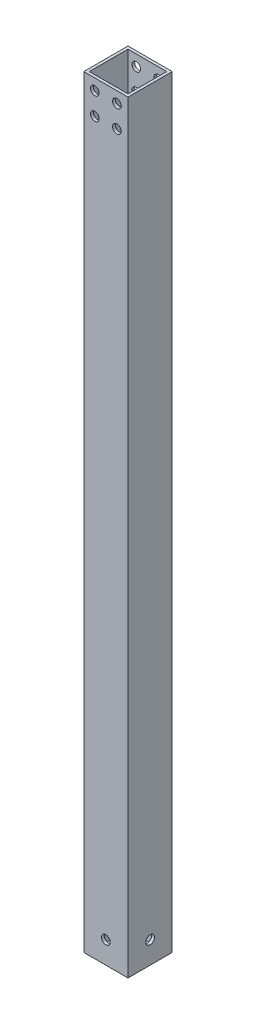
ISO-10303-21;
HEADER;
FILE_DESCRIPTION(('STEP AP214'),'2;1');
FILE_NAME('part.step','',(''),(''),'','','');
FILE_SCHEMA(('AUTOMOTIVE_DESIGN { 1 0 10303 214 1 1 1 1 }'));
ENDSEC;
DATA;
#1=APPLICATION_CONTEXT('core data for automotive mechanical design processes');
#2=APPLICATION_PROTOCOL_DEFINITION('international standard','automotive_design',2000,#1);
#3=PRODUCT_CONTEXT('',#1,'mechanical');
#4=PRODUCT('Part','Part','',(#3));
#5=PRODUCT_RELATED_PRODUCT_CATEGORY('part','',(#4));
#6=PRODUCT_DEFINITION_FORMATION('','',#4);
#7=PRODUCT_DEFINITION_CONTEXT('part definition',#1,'design');
#8=PRODUCT_DEFINITION('design','',#6,#7);
#9=PRODUCT_DEFINITION_SHAPE('','',#8);
#10=(LENGTH_UNIT() NAMED_UNIT(*) SI_UNIT(.MILLI.,.METRE.));
#11=(NAMED_UNIT(*) PLANE_ANGLE_UNIT() SI_UNIT($,.RADIAN.));
#12=(NAMED_UNIT(*) SI_UNIT($,.STERADIAN.) SOLID_ANGLE_UNIT());
#13=UNCERTAINTY_MEASURE_WITH_UNIT(LENGTH_MEASURE(1.E-05),#10,'distance_accuracy_value','');
#14=(GEOMETRIC_REPRESENTATION_CONTEXT(3) GLOBAL_UNCERTAINTY_ASSIGNED_CONTEXT((#13)) GLOBAL_UNIT_ASSIGNED_CONTEXT((#10,
#11,#12)) REPRESENTATION_CONTEXT('',''));
#15=CARTESIAN_POINT('',(0.,0.,0.));
#16=DIRECTION('',(0.,0.,1.));
#17=DIRECTION('',(1.,0.,0.));
#18=AXIS2_PLACEMENT_3D('',#15,#16,#17);
#19=CARTESIAN_POINT('',(12.7,955.562720587149,-25.4));
#20=DIRECTION('',(0.,1.,0.));
#21=DIRECTION('',(0.,0.,1.));
#22=AXIS2_PLACEMENT_3D('',#19,#20,#21);
#23=PLANE('',#22);
#24=DIRECTION('',(-1.,0.,0.));
#25=VECTOR('',#24,1.);
#26=CARTESIAN_POINT('',(12.7,955.562720587149,0.));
#27=LINE('',#26,#25);
#28=CARTESIAN_POINT('',(38.1000000000002,955.562720587149,0.));
#29=VERTEX_POINT('',#28);
#30=CARTESIAN_POINT('',(12.7,955.562720587149,0.));
#31=VERTEX_POINT('',#30);
#32=EDGE_CURVE('E143',#29,#31,#27,.T.);
#33=ORIENTED_EDGE('',*,*,#32,.F.);
#34=DIRECTION('',(0.,0.,1.));
#35=VECTOR('',#34,1.);
#36=CARTESIAN_POINT('',(38.1000000000002,955.562720587149,-25.4));
#37=LINE('',#36,#35);
#38=CARTESIAN_POINT('',(38.1000000000002,955.562720587149,-25.4));
#39=VERTEX_POINT('',#38);
#40=EDGE_CURVE('E46',#39,#29,#37,.T.);
#41=ORIENTED_EDGE('',*,*,#40,.F.);
#42=DIRECTION('',(-1.,0.,0.));
#43=VECTOR('',#42,1.);
#44=CARTESIAN_POINT('',(12.7,955.562720587149,-25.4));
#45=LINE('',#44,#43);
#46=CARTESIAN_POINT('',(12.7,955.562720587149,-25.4));
#47=VERTEX_POINT('',#46);
#48=EDGE_CURVE('E149',#39,#47,#45,.T.);
#49=ORIENTED_EDGE('',*,*,#48,.T.);
#50=DIRECTION('',(0.,0.,1.));
#51=VECTOR('',#50,1.);
#52=CARTESIAN_POINT('',(12.7,955.562720587149,-25.4));
#53=LINE('',#52,#51);
#54=EDGE_CURVE('E11',#47,#31,#53,.T.);
#55=ORIENTED_EDGE('',*,*,#54,.T.);
#56=EDGE_LOOP('',(#33,#41,#49,#55));
#57=FACE_BOUND('',#56,.T.);
#58=DIRECTION('',(0.,0.,1.));
#59=VECTOR('',#58,1.);
#60=CARTESIAN_POINT('',(36.5125000000002,955.562720587149,-25.4));
#61=LINE('',#60,#59);
#62=CARTESIAN_POINT('',(36.5125000000002,955.562720587149,-23.8125));
#63=VERTEX_POINT('',#62);
#64=CARTESIAN_POINT('',(36.5125000000002,955.562720587149,-1.5875));
#65=VERTEX_POINT('',#64);
#66=EDGE_CURVE('E113',#63,#65,#61,.T.);
#67=ORIENTED_EDGE('',*,*,#66,.T.);
#68=DIRECTION('',(-1.,0.,0.));
#69=VECTOR('',#68,1.);
#70=CARTESIAN_POINT('',(0.,955.562720587149,-1.5875));
#71=LINE('',#70,#69);
#72=CARTESIAN_POINT('',(14.2875,955.562720587149,-1.5875));
#73=VERTEX_POINT('',#72);
#74=EDGE_CURVE('E119',#65,#73,#71,.T.);
#75=ORIENTED_EDGE('',*,*,#74,.T.);
#76=DIRECTION('',(0.,0.,1.));
#77=VECTOR('',#76,1.);
#78=CARTESIAN_POINT('',(14.2875,955.562720587149,-25.4));
#79=LINE('',#78,#77);
#80=CARTESIAN_POINT('',(14.2875,955.562720587149,-23.8125));
#81=VERTEX_POINT('',#80);
#82=EDGE_CURVE('E104',#81,#73,#79,.T.);
#83=ORIENTED_EDGE('',*,*,#82,.F.);
#84=DIRECTION('',(-1.,0.,0.));
#85=VECTOR('',#84,1.);
#86=CARTESIAN_POINT('',(0.,955.562720587149,-23.8125));
#87=LINE('',#86,#85);
#88=EDGE_CURVE('E54',#63,#81,#87,.T.);
#89=ORIENTED_EDGE('',*,*,#88,.F.);
#90=EDGE_LOOP('',(#67,#75,#83,#89));
#91=FACE_BOUND('',#90,.T.);
#92=ADVANCED_FACE('F37',(#57,#91),#23,.T.);
#93=CARTESIAN_POINT('',(12.7,517.412720587149,-25.4));
#94=DIRECTION('',(0.,-1.,0.));
#95=DIRECTION('',(0.,0.,-1.));
#96=AXIS2_PLACEMENT_3D('',#93,#94,#95);
#97=PLANE('',#96);
#98=DIRECTION('',(1.,0.,0.));
#99=VECTOR('',#98,1.);
#100=CARTESIAN_POINT('',(12.7,517.412720587149,0.));
#101=LINE('',#100,#99);
#102=CARTESIAN_POINT('',(12.7,517.412720587149,0.));
#103=VERTEX_POINT('',#102);
#104=CARTESIAN_POINT('',(38.1000000000003,517.412720587149,0.));
#105=VERTEX_POINT('',#104);
#106=EDGE_CURVE('E155',#103,#105,#101,.T.);
#107=ORIENTED_EDGE('',*,*,#106,.F.);
#108=DIRECTION('',(0.,0.,1.));
#109=VECTOR('',#108,1.);
#110=CARTESIAN_POINT('',(12.7,517.412720587149,-25.4));
#111=LINE('',#110,#109);
#112=CARTESIAN_POINT('',(12.7,517.412720587149,-25.4));
#113=VERTEX_POINT('',#112);
#114=EDGE_CURVE('E152',#113,#103,#111,.T.);
#115=ORIENTED_EDGE('',*,*,#114,.F.);
#116=DIRECTION('',(1.,0.,0.));
#117=VECTOR('',#116,1.);
#118=CARTESIAN_POINT('',(12.7,517.412720587149,-25.4));
#119=LINE('',#118,#117);
#120=CARTESIAN_POINT('',(38.1000000000003,517.412720587149,-25.4));
#121=VERTEX_POINT('',#120);
#122=EDGE_CURVE('E142',#113,#121,#119,.T.);
#123=ORIENTED_EDGE('',*,*,#122,.T.);
#124=DIRECTION('',(0.,0.,1.));
#125=VECTOR('',#124,1.);
#126=CARTESIAN_POINT('',(38.1000000000003,517.412720587149,-25.4));
#127=LINE('',#126,#125);
#128=EDGE_CURVE('E164',#121,#105,#127,.T.);
#129=ORIENTED_EDGE('',*,*,#128,.T.);
#130=EDGE_LOOP('',(#107,#115,#123,#129));
#131=FACE_BOUND('',#130,.T.);
#132=DIRECTION('',(0.,0.,1.));
#133=VECTOR('',#132,1.);
#134=CARTESIAN_POINT('',(14.2875,517.412720587149,-25.4));
#135=LINE('',#134,#133);
#136=CARTESIAN_POINT('',(14.2875,517.412720587149,-23.8125));
#137=VERTEX_POINT('',#136);
#138=CARTESIAN_POINT('',(14.2875,517.412720587149,-1.5875));
#139=VERTEX_POINT('',#138);
#140=EDGE_CURVE('E133',#137,#139,#135,.T.);
#141=ORIENTED_EDGE('',*,*,#140,.T.);
#142=DIRECTION('',(1.,0.,0.));
#143=VECTOR('',#142,1.);
#144=CARTESIAN_POINT('',(0.,517.412720587149,-1.5875));
#145=LINE('',#144,#143);
#146=CARTESIAN_POINT('',(36.5125000000003,517.412720587149,-1.5875));
#147=VERTEX_POINT('',#146);
#148=EDGE_CURVE('E122',#139,#147,#145,.T.);
#149=ORIENTED_EDGE('',*,*,#148,.T.);
#150=DIRECTION('',(0.,0.,1.));
#151=VECTOR('',#150,1.);
#152=CARTESIAN_POINT('',(36.5125000000003,517.412720587149,-25.4));
#153=LINE('',#152,#151);
#154=CARTESIAN_POINT('',(36.5125000000003,517.412720587149,-23.8125));
#155=VERTEX_POINT('',#154);
#156=EDGE_CURVE('E131',#155,#147,#153,.T.);
#157=ORIENTED_EDGE('',*,*,#156,.F.);
#158=DIRECTION('',(1.,0.,0.));
#159=VECTOR('',#158,1.);
#160=CARTESIAN_POINT('',(0.,517.412720587149,-23.8125));
#161=LINE('',#160,#159);
#162=EDGE_CURVE('E59',#137,#155,#161,.T.);
#163=ORIENTED_EDGE('',*,*,#162,.F.);
#164=EDGE_LOOP('',(#141,#149,#157,#163));
#165=FACE_BOUND('',#164,.T.);
#166=ADVANCED_FACE('F201',(#131,#165),#97,.T.);
#167=CARTESIAN_POINT('',(12.7,955.562720587149,-25.4));
#168=DIRECTION('',(-1.,0.,0.));
#169=DIRECTION('',(0.,-1.,0.));
#170=AXIS2_PLACEMENT_3D('',#167,#168,#169);
#171=PLANE('',#170);
#172=CARTESIAN_POINT('',(12.7000000000002,530.112720587149,-12.7));
#173=DIRECTION('',(1.,0.,0.));
#174=DIRECTION('',(0.,1.,0.));
#175=AXIS2_PLACEMENT_3D('',#172,#173,#174);
#176=CIRCLE('',#175,2.4892);
#177=CARTESIAN_POINT('',(12.7000000000002,532.601920587149,-12.7));
#178=VERTEX_POINT('',#177);
#179=EDGE_CURVE('E271',#178,#178,#176,.T.);
#180=ORIENTED_EDGE('',*,*,#179,.T.);
#181=EDGE_LOOP('',(#180));
#182=FACE_BOUND('',#181,.T.);
#183=DIRECTION('',(0.,-1.,0.));
#184=VECTOR('',#183,1.);
#185=CARTESIAN_POINT('',(12.7,955.562720587149,0.));
#186=LINE('',#185,#184);
#187=EDGE_CURVE('E112',#31,#103,#186,.T.);
#188=ORIENTED_EDGE('',*,*,#187,.F.);
#189=ORIENTED_EDGE('',*,*,#54,.F.);
#190=DIRECTION('',(0.,-1.,0.));
#191=VECTOR('',#190,1.);
#192=CARTESIAN_POINT('',(12.7,955.562720587149,-25.4));
#193=LINE('',#192,#191);
#194=EDGE_CURVE('E139',#47,#113,#193,.T.);
#195=ORIENTED_EDGE('',*,*,#194,.T.);
#196=ORIENTED_EDGE('',*,*,#114,.T.);
#197=EDGE_LOOP('',(#188,#189,#195,#196));
#198=FACE_BOUND('',#197,.T.);
#199=ADVANCED_FACE('F39',(#182,#198),#171,.T.);
#200=CARTESIAN_POINT('',(38.1000000000002,955.562720587149,-25.4));
#201=DIRECTION('',(1.,0.,0.));
#202=DIRECTION('',(0.,1.,0.));
#203=AXIS2_PLACEMENT_3D('',#200,#201,#202);
#204=PLANE('',#203);
#205=CARTESIAN_POINT('',(38.1000000000002,530.112720587149,-12.7));
#206=DIRECTION('',(1.,0.,0.));
#207=DIRECTION('',(0.,1.,0.));
#208=AXIS2_PLACEMENT_3D('',#205,#206,#207);
#209=CIRCLE('',#208,2.4892);
#210=CARTESIAN_POINT('',(38.1000000000002,532.601920587149,-12.7));
#211=VERTEX_POINT('',#210);
#212=EDGE_CURVE('E283',#211,#211,#209,.T.);
#213=ORIENTED_EDGE('',*,*,#212,.F.);
#214=EDGE_LOOP('',(#213));
#215=FACE_BOUND('',#214,.T.);
#216=DIRECTION('',(0.,1.,0.));
#217=VECTOR('',#216,1.);
#218=CARTESIAN_POINT('',(38.1000000000002,955.562720587149,0.));
#219=LINE('',#218,#217);
#220=EDGE_CURVE('E158',#105,#29,#219,.T.);
#221=ORIENTED_EDGE('',*,*,#220,.F.);
#222=ORIENTED_EDGE('',*,*,#128,.F.);
#223=DIRECTION('',(0.,1.,0.));
#224=VECTOR('',#223,1.);
#225=CARTESIAN_POINT('',(38.1000000000002,955.562720587149,-25.4));
#226=LINE('',#225,#224);
#227=EDGE_CURVE('E146',#121,#39,#226,.T.);
#228=ORIENTED_EDGE('',*,*,#227,.T.);
#229=ORIENTED_EDGE('',*,*,#40,.T.);
#230=EDGE_LOOP('',(#221,#222,#228,#229));
#231=FACE_BOUND('',#230,.T.);
#232=ADVANCED_FACE('F208',(#215,#231),#204,.T.);
#233=CARTESIAN_POINT('',(0.,0.,-25.4));
#234=DIRECTION('',(0.,0.,1.));
#235=DIRECTION('',(1.,0.,0.));
#236=AXIS2_PLACEMENT_3D('',#233,#234,#235);
#237=PLANE('',#236);
#238=CARTESIAN_POINT('',(25.4000000000001,530.112720587149,-25.4));
#239=DIRECTION('',(0.,0.,1.));
#240=DIRECTION('',(1.,0.,0.));
#241=AXIS2_PLACEMENT_3D('',#238,#239,#240);
#242=CIRCLE('',#241,2.48919999999996);
#243=CARTESIAN_POINT('',(27.8892,530.112720587149,-25.4));
#244=VERTEX_POINT('',#243);
#245=EDGE_CURVE('E171',#244,#244,#242,.T.);
#246=ORIENTED_EDGE('',*,*,#245,.T.);
#247=EDGE_LOOP('',(#246));
#248=FACE_BOUND('',#247,.T.);
#249=CARTESIAN_POINT('',(31.7500000000001,949.212720587149,-25.4));
#250=DIRECTION('',(0.,0.,1.));
#251=DIRECTION('',(1.,0.,0.));
#252=AXIS2_PLACEMENT_3D('',#249,#250,#251);
#253=CIRCLE('',#252,2.48919999999991);
#254=CARTESIAN_POINT('',(34.2392,949.212720587149,-25.4));
#255=VERTEX_POINT('',#254);
#256=EDGE_CURVE('E293',#255,#255,#253,.T.);
#257=ORIENTED_EDGE('',*,*,#256,.T.);
#258=EDGE_LOOP('',(#257));
#259=FACE_BOUND('',#258,.T.);
#260=CARTESIAN_POINT('',(19.0500000000001,949.212720587149,-25.4));
#261=DIRECTION('',(0.,0.,1.));
#262=DIRECTION('',(1.,0.,0.));
#263=AXIS2_PLACEMENT_3D('',#260,#261,#262);
#264=CIRCLE('',#263,2.48919999999989);
#265=CARTESIAN_POINT('',(21.5392,949.212720587149,-25.4));
#266=VERTEX_POINT('',#265);
#267=EDGE_CURVE('E299',#266,#266,#264,.T.);
#268=ORIENTED_EDGE('',*,*,#267,.T.);
#269=EDGE_LOOP('',(#268));
#270=FACE_BOUND('',#269,.T.);
#271=CARTESIAN_POINT('',(19.0500000000001,936.512720587149,-25.4));
#272=DIRECTION('',(0.,0.,1.));
#273=DIRECTION('',(1.,0.,0.));
#274=AXIS2_PLACEMENT_3D('',#271,#272,#273);
#275=CIRCLE('',#274,2.48919999999989);
#276=CARTESIAN_POINT('',(21.5392,936.512720587149,-25.4));
#277=VERTEX_POINT('',#276);
#278=EDGE_CURVE('E305',#277,#277,#275,.T.);
#279=ORIENTED_EDGE('',*,*,#278,.T.);
#280=EDGE_LOOP('',(#279));
#281=FACE_BOUND('',#280,.T.);
#282=CARTESIAN_POINT('',(31.7500000000001,936.512720587149,-25.4));
#283=DIRECTION('',(0.,0.,1.));
#284=DIRECTION('',(1.,0.,0.));
#285=AXIS2_PLACEMENT_3D('',#282,#283,#284);
#286=CIRCLE('',#285,2.48919999999991);
#287=CARTESIAN_POINT('',(34.2392,936.512720587149,-25.4));
#288=VERTEX_POINT('',#287);
#289=EDGE_CURVE('E275',#288,#288,#286,.T.);
#290=ORIENTED_EDGE('',*,*,#289,.T.);
#291=EDGE_LOOP('',(#290));
#292=FACE_BOUND('',#291,.T.);
#293=ORIENTED_EDGE('',*,*,#194,.F.);
#294=ORIENTED_EDGE('',*,*,#48,.F.);
#295=ORIENTED_EDGE('',*,*,#227,.F.);
#296=ORIENTED_EDGE('',*,*,#122,.F.);
#297=EDGE_LOOP('',(#293,#294,#295,#296));
#298=FACE_BOUND('',#297,.T.);
#299=ADVANCED_FACE('F215',(#248,#259,#270,#281,#292,#298),#237,.F.);
#300=CARTESIAN_POINT('',(0.,0.,0.));
#301=DIRECTION('',(0.,0.,1.));
#302=DIRECTION('',(1.,0.,0.));
#303=AXIS2_PLACEMENT_3D('',#300,#301,#302);
#304=PLANE('',#303);
#305=CARTESIAN_POINT('',(25.4000000000001,530.112720587149,0.));
#306=DIRECTION('',(0.,0.,1.));
#307=DIRECTION('',(1.,0.,0.));
#308=AXIS2_PLACEMENT_3D('',#305,#306,#307);
#309=CIRCLE('',#308,2.48919999999996);
#310=CARTESIAN_POINT('',(27.8892,530.112720587149,0.));
#311=VERTEX_POINT('',#310);
#312=EDGE_CURVE('E287',#311,#311,#309,.T.);
#313=ORIENTED_EDGE('',*,*,#312,.F.);
#314=EDGE_LOOP('',(#313));
#315=FACE_BOUND('',#314,.T.);
#316=CARTESIAN_POINT('',(31.7500000000001,949.212720587149,0.));
#317=DIRECTION('',(0.,0.,1.));
#318=DIRECTION('',(1.,0.,0.));
#319=AXIS2_PLACEMENT_3D('',#316,#317,#318);
#320=CIRCLE('',#319,2.48919999999991);
#321=CARTESIAN_POINT('',(34.2392,949.212720587149,0.));
#322=VERTEX_POINT('',#321);
#323=EDGE_CURVE('E290',#322,#322,#320,.T.);
#324=ORIENTED_EDGE('',*,*,#323,.F.);
#325=EDGE_LOOP('',(#324));
#326=FACE_BOUND('',#325,.T.);
#327=CARTESIAN_POINT('',(19.0500000000001,949.212720587149,0.));
#328=DIRECTION('',(0.,0.,1.));
#329=DIRECTION('',(1.,0.,0.));
#330=AXIS2_PLACEMENT_3D('',#327,#328,#329);
#331=CIRCLE('',#330,2.48919999999989);
#332=CARTESIAN_POINT('',(21.5392,949.212720587149,0.));
#333=VERTEX_POINT('',#332);
#334=EDGE_CURVE('E296',#333,#333,#331,.T.);
#335=ORIENTED_EDGE('',*,*,#334,.F.);
#336=EDGE_LOOP('',(#335));
#337=FACE_BOUND('',#336,.T.);
#338=CARTESIAN_POINT('',(19.0500000000001,936.512720587149,0.));
#339=DIRECTION('',(0.,0.,1.));
#340=DIRECTION('',(1.,0.,0.));
#341=AXIS2_PLACEMENT_3D('',#338,#339,#340);
#342=CIRCLE('',#341,2.48919999999989);
#343=CARTESIAN_POINT('',(21.5392,936.512720587149,0.));
#344=VERTEX_POINT('',#343);
#345=EDGE_CURVE('E302',#344,#344,#342,.T.);
#346=ORIENTED_EDGE('',*,*,#345,.F.);
#347=EDGE_LOOP('',(#346));
#348=FACE_BOUND('',#347,.T.);
#349=CARTESIAN_POINT('',(31.7500000000001,936.512720587149,0.));
#350=DIRECTION('',(0.,0.,1.));
#351=DIRECTION('',(1.,0.,0.));
#352=AXIS2_PLACEMENT_3D('',#349,#350,#351);
#353=CIRCLE('',#352,2.48919999999991);
#354=CARTESIAN_POINT('',(34.2392,936.512720587149,0.));
#355=VERTEX_POINT('',#354);
#356=EDGE_CURVE('E278',#355,#355,#353,.T.);
#357=ORIENTED_EDGE('',*,*,#356,.F.);
#358=EDGE_LOOP('',(#357));
#359=FACE_BOUND('',#358,.T.);
#360=ORIENTED_EDGE('',*,*,#187,.T.);
#361=ORIENTED_EDGE('',*,*,#106,.T.);
#362=ORIENTED_EDGE('',*,*,#220,.T.);
#363=ORIENTED_EDGE('',*,*,#32,.T.);
#364=EDGE_LOOP('',(#360,#361,#362,#363));
#365=FACE_BOUND('',#364,.T.);
#366=ADVANCED_FACE('F218',(#315,#326,#337,#348,#359,#365),#304,.T.);
#367=CARTESIAN_POINT('',(14.2875,955.562720587149,-25.4));
#368=DIRECTION('',(-1.,0.,0.));
#369=DIRECTION('',(0.,-1.,0.));
#370=AXIS2_PLACEMENT_3D('',#367,#368,#369);
#371=PLANE('',#370);
#372=CARTESIAN_POINT('',(14.2875,530.112720587149,-12.7));
#373=DIRECTION('',(-1.,0.,0.));
#374=DIRECTION('',(0.,-1.,0.));
#375=AXIS2_PLACEMENT_3D('',#372,#373,#374);
#376=CIRCLE('',#375,2.4892);
#377=CARTESIAN_POINT('',(14.2875,527.623520587149,-12.7));
#378=VERTEX_POINT('',#377);
#379=EDGE_CURVE('E274',#378,#378,#376,.T.);
#380=ORIENTED_EDGE('',*,*,#379,.T.);
#381=EDGE_LOOP('',(#380));
#382=FACE_BOUND('',#381,.T.);
#383=DIRECTION('',(0.,-1.,0.));
#384=VECTOR('',#383,1.);
#385=CARTESIAN_POINT('',(14.2875,0.,-1.5875));
#386=LINE('',#385,#384);
#387=EDGE_CURVE('E107',#73,#139,#386,.T.);
#388=ORIENTED_EDGE('',*,*,#387,.T.);
#389=ORIENTED_EDGE('',*,*,#140,.F.);
#390=DIRECTION('',(0.,-1.,0.));
#391=VECTOR('',#390,1.);
#392=CARTESIAN_POINT('',(14.2875,0.,-23.8125));
#393=LINE('',#392,#391);
#394=EDGE_CURVE('E109',#81,#137,#393,.T.);
#395=ORIENTED_EDGE('',*,*,#394,.F.);
#396=ORIENTED_EDGE('',*,*,#82,.T.);
#397=EDGE_LOOP('',(#388,#389,#395,#396));
#398=FACE_BOUND('',#397,.T.);
#399=ADVANCED_FACE('F106',(#382,#398),#371,.F.);
#400=CARTESIAN_POINT('',(36.5125000000002,955.562720587149,-25.4));
#401=DIRECTION('',(1.,0.,0.));
#402=DIRECTION('',(0.,1.,0.));
#403=AXIS2_PLACEMENT_3D('',#400,#401,#402);
#404=PLANE('',#403);
#405=CARTESIAN_POINT('',(36.5125000000003,530.112720587149,-12.7));
#406=DIRECTION('',(1.,0.,0.));
#407=DIRECTION('',(0.,1.,0.));
#408=AXIS2_PLACEMENT_3D('',#405,#406,#407);
#409=CIRCLE('',#408,2.4892);
#410=CARTESIAN_POINT('',(36.5125000000003,532.601920587149,-12.7));
#411=VERTEX_POINT('',#410);
#412=EDGE_CURVE('E41',#411,#411,#409,.T.);
#413=ORIENTED_EDGE('',*,*,#412,.T.);
#414=EDGE_LOOP('',(#413));
#415=FACE_BOUND('',#414,.T.);
#416=DIRECTION('',(0.,1.,0.));
#417=VECTOR('',#416,1.);
#418=CARTESIAN_POINT('',(36.5125000000004,0.,-1.5875));
#419=LINE('',#418,#417);
#420=EDGE_CURVE('E125',#147,#65,#419,.T.);
#421=ORIENTED_EDGE('',*,*,#420,.T.);
#422=ORIENTED_EDGE('',*,*,#66,.F.);
#423=DIRECTION('',(0.,1.,0.));
#424=VECTOR('',#423,1.);
#425=CARTESIAN_POINT('',(36.5125000000004,0.,-23.8125));
#426=LINE('',#425,#424);
#427=EDGE_CURVE('E134',#155,#63,#426,.T.);
#428=ORIENTED_EDGE('',*,*,#427,.F.);
#429=ORIENTED_EDGE('',*,*,#156,.T.);
#430=EDGE_LOOP('',(#421,#422,#428,#429));
#431=FACE_BOUND('',#430,.T.);
#432=ADVANCED_FACE('F199',(#415,#431),#404,.F.);
#433=CARTESIAN_POINT('',(0.,0.,-23.8125));
#434=DIRECTION('',(0.,0.,1.));
#435=DIRECTION('',(1.,0.,0.));
#436=AXIS2_PLACEMENT_3D('',#433,#434,#435);
#437=PLANE('',#436);
#438=CARTESIAN_POINT('',(25.4000000000001,530.112720587149,-23.8125));
#439=DIRECTION('',(0.,0.,1.));
#440=DIRECTION('',(1.,0.,0.));
#441=AXIS2_PLACEMENT_3D('',#438,#439,#440);
#442=CIRCLE('',#441,2.48919999999996);
#443=CARTESIAN_POINT('',(27.8892,530.112720587149,-23.8125));
#444=VERTEX_POINT('',#443);
#445=EDGE_CURVE('E123',#444,#444,#442,.T.);
#446=ORIENTED_EDGE('',*,*,#445,.F.);
#447=EDGE_LOOP('',(#446));
#448=FACE_BOUND('',#447,.T.);
#449=CARTESIAN_POINT('',(31.7500000000001,949.212720587149,-23.8125));
#450=DIRECTION('',(0.,0.,1.));
#451=DIRECTION('',(1.,0.,0.));
#452=AXIS2_PLACEMENT_3D('',#449,#450,#451);
#453=CIRCLE('',#452,2.48919999999991);
#454=CARTESIAN_POINT('',(34.2392,949.212720587149,-23.8125));
#455=VERTEX_POINT('',#454);
#456=EDGE_CURVE('E182',#455,#455,#453,.T.);
#457=ORIENTED_EDGE('',*,*,#456,.F.);
#458=EDGE_LOOP('',(#457));
#459=FACE_BOUND('',#458,.T.);
#460=CARTESIAN_POINT('',(19.0500000000001,949.212720587149,-23.8125));
#461=DIRECTION('',(0.,0.,1.));
#462=DIRECTION('',(1.,0.,0.));
#463=AXIS2_PLACEMENT_3D('',#460,#461,#462);
#464=CIRCLE('',#463,2.48919999999989);
#465=CARTESIAN_POINT('',(21.5392,949.212720587149,-23.8125));
#466=VERTEX_POINT('',#465);
#467=EDGE_CURVE('E179',#466,#466,#464,.T.);
#468=ORIENTED_EDGE('',*,*,#467,.F.);
#469=EDGE_LOOP('',(#468));
#470=FACE_BOUND('',#469,.T.);
#471=CARTESIAN_POINT('',(19.0500000000001,936.512720587149,-23.8125));
#472=DIRECTION('',(0.,0.,1.));
#473=DIRECTION('',(1.,0.,0.));
#474=AXIS2_PLACEMENT_3D('',#471,#472,#473);
#475=CIRCLE('',#474,2.48919999999989);
#476=CARTESIAN_POINT('',(21.5392,936.512720587149,-23.8125));
#477=VERTEX_POINT('',#476);
#478=EDGE_CURVE('E175',#477,#477,#475,.T.);
#479=ORIENTED_EDGE('',*,*,#478,.F.);
#480=EDGE_LOOP('',(#479));
#481=FACE_BOUND('',#480,.T.);
#482=CARTESIAN_POINT('',(31.7500000000001,936.512720587149,-23.8125));
#483=DIRECTION('',(0.,0.,1.));
#484=DIRECTION('',(1.,0.,0.));
#485=AXIS2_PLACEMENT_3D('',#482,#483,#484);
#486=CIRCLE('',#485,2.48919999999991);
#487=CARTESIAN_POINT('',(34.2392,936.512720587149,-23.8125));
#488=VERTEX_POINT('',#487);
#489=EDGE_CURVE('E170',#488,#488,#486,.T.);
#490=ORIENTED_EDGE('',*,*,#489,.F.);
#491=EDGE_LOOP('',(#490));
#492=FACE_BOUND('',#491,.T.);
#493=ORIENTED_EDGE('',*,*,#394,.T.);
#494=ORIENTED_EDGE('',*,*,#162,.T.);
#495=ORIENTED_EDGE('',*,*,#427,.T.);
#496=ORIENTED_EDGE('',*,*,#88,.T.);
#497=EDGE_LOOP('',(#493,#494,#495,#496));
#498=FACE_BOUND('',#497,.T.);
#499=ADVANCED_FACE('F196',(#448,#459,#470,#481,#492,#498),#437,.T.);
#500=CARTESIAN_POINT('',(0.,0.,-1.5875));
#501=DIRECTION('',(0.,0.,1.));
#502=DIRECTION('',(1.,0.,0.));
#503=AXIS2_PLACEMENT_3D('',#500,#501,#502);
#504=PLANE('',#503);
#505=CARTESIAN_POINT('',(25.4000000000001,530.112720587149,-1.5875));
#506=DIRECTION('',(0.,0.,1.));
#507=DIRECTION('',(1.,0.,0.));
#508=AXIS2_PLACEMENT_3D('',#505,#506,#507);
#509=CIRCLE('',#508,2.48919999999996);
#510=CARTESIAN_POINT('',(27.8892,530.112720587149,-1.5875));
#511=VERTEX_POINT('',#510);
#512=EDGE_CURVE('E183',#511,#511,#509,.T.);
#513=ORIENTED_EDGE('',*,*,#512,.T.);
#514=EDGE_LOOP('',(#513));
#515=FACE_BOUND('',#514,.T.);
#516=CARTESIAN_POINT('',(31.7500000000001,949.212720587149,-1.5875));
#517=DIRECTION('',(0.,0.,1.));
#518=DIRECTION('',(1.,0.,0.));
#519=AXIS2_PLACEMENT_3D('',#516,#517,#518);
#520=CIRCLE('',#519,2.48919999999991);
#521=CARTESIAN_POINT('',(34.2392,949.212720587149,-1.5875));
#522=VERTEX_POINT('',#521);
#523=EDGE_CURVE('E180',#522,#522,#520,.T.);
#524=ORIENTED_EDGE('',*,*,#523,.T.);
#525=EDGE_LOOP('',(#524));
#526=FACE_BOUND('',#525,.T.);
#527=CARTESIAN_POINT('',(19.0500000000001,949.212720587149,-1.5875));
#528=DIRECTION('',(0.,0.,1.));
#529=DIRECTION('',(1.,0.,0.));
#530=AXIS2_PLACEMENT_3D('',#527,#528,#529);
#531=CIRCLE('',#530,2.48919999999989);
#532=CARTESIAN_POINT('',(21.5392,949.212720587149,-1.5875));
#533=VERTEX_POINT('',#532);
#534=EDGE_CURVE('E176',#533,#533,#531,.T.);
#535=ORIENTED_EDGE('',*,*,#534,.T.);
#536=EDGE_LOOP('',(#535));
#537=FACE_BOUND('',#536,.T.);
#538=CARTESIAN_POINT('',(19.0500000000001,936.512720587149,-1.5875));
#539=DIRECTION('',(0.,0.,1.));
#540=DIRECTION('',(1.,0.,0.));
#541=AXIS2_PLACEMENT_3D('',#538,#539,#540);
#542=CIRCLE('',#541,2.48919999999989);
#543=CARTESIAN_POINT('',(21.5392,936.512720587149,-1.5875));
#544=VERTEX_POINT('',#543);
#545=EDGE_CURVE('E172',#544,#544,#542,.T.);
#546=ORIENTED_EDGE('',*,*,#545,.T.);
#547=EDGE_LOOP('',(#546));
#548=FACE_BOUND('',#547,.T.);
#549=CARTESIAN_POINT('',(31.7500000000001,936.512720587149,-1.5875));
#550=DIRECTION('',(0.,0.,1.));
#551=DIRECTION('',(1.,0.,0.));
#552=AXIS2_PLACEMENT_3D('',#549,#550,#551);
#553=CIRCLE('',#552,2.48919999999991);
#554=CARTESIAN_POINT('',(34.2392,936.512720587149,-1.5875));
#555=VERTEX_POINT('',#554);
#556=EDGE_CURVE('E167',#555,#555,#553,.T.);
#557=ORIENTED_EDGE('',*,*,#556,.T.);
#558=EDGE_LOOP('',(#557));
#559=FACE_BOUND('',#558,.T.);
#560=ORIENTED_EDGE('',*,*,#387,.F.);
#561=ORIENTED_EDGE('',*,*,#74,.F.);
#562=ORIENTED_EDGE('',*,*,#420,.F.);
#563=ORIENTED_EDGE('',*,*,#148,.F.);
#564=EDGE_LOOP('',(#560,#561,#562,#563));
#565=FACE_BOUND('',#564,.T.);
#566=ADVANCED_FACE('F117',(#515,#526,#537,#548,#559,#565),#504,.F.);
#567=CARTESIAN_POINT('',(31.7500000000001,936.512720587149,-25.4));
#568=DIRECTION('',(0.,0.,1.));
#569=DIRECTION('',(1.,0.,0.));
#570=AXIS2_PLACEMENT_3D('',#567,#568,#569);
#571=CYLINDRICAL_SURFACE('',#570,2.48919999999991);
#572=ORIENTED_EDGE('',*,*,#356,.T.);
#573=EDGE_LOOP('',(#572));
#574=FACE_BOUND('',#573,.T.);
#575=ORIENTED_EDGE('',*,*,#556,.F.);
#576=EDGE_LOOP('',(#575));
#577=FACE_BOUND('',#576,.T.);
#578=ADVANCED_FACE('F227',(#574,#577),#571,.F.);
#579=CARTESIAN_POINT('',(19.0500000000001,936.512720587149,-25.4));
#580=DIRECTION('',(0.,0.,1.));
#581=DIRECTION('',(1.,0.,0.));
#582=AXIS2_PLACEMENT_3D('',#579,#580,#581);
#583=CYLINDRICAL_SURFACE('',#582,2.48919999999989);
#584=ORIENTED_EDGE('',*,*,#345,.T.);
#585=EDGE_LOOP('',(#584));
#586=FACE_BOUND('',#585,.T.);
#587=ORIENTED_EDGE('',*,*,#545,.F.);
#588=EDGE_LOOP('',(#587));
#589=FACE_BOUND('',#588,.T.);
#590=ADVANCED_FACE('F247',(#586,#589),#583,.F.);
#591=CARTESIAN_POINT('',(19.0500000000001,949.212720587149,-25.4));
#592=DIRECTION('',(0.,0.,1.));
#593=DIRECTION('',(1.,0.,0.));
#594=AXIS2_PLACEMENT_3D('',#591,#592,#593);
#595=CYLINDRICAL_SURFACE('',#594,2.48919999999989);
#596=ORIENTED_EDGE('',*,*,#334,.T.);
#597=EDGE_LOOP('',(#596));
#598=FACE_BOUND('',#597,.T.);
#599=ORIENTED_EDGE('',*,*,#534,.F.);
#600=EDGE_LOOP('',(#599));
#601=FACE_BOUND('',#600,.T.);
#602=ADVANCED_FACE('F252',(#598,#601),#595,.F.);
#603=CARTESIAN_POINT('',(31.7500000000001,949.212720587149,-25.4));
#604=DIRECTION('',(0.,0.,1.));
#605=DIRECTION('',(1.,0.,0.));
#606=AXIS2_PLACEMENT_3D('',#603,#604,#605);
#607=CYLINDRICAL_SURFACE('',#606,2.48919999999991);
#608=ORIENTED_EDGE('',*,*,#323,.T.);
#609=EDGE_LOOP('',(#608));
#610=FACE_BOUND('',#609,.T.);
#611=ORIENTED_EDGE('',*,*,#523,.F.);
#612=EDGE_LOOP('',(#611));
#613=FACE_BOUND('',#612,.T.);
#614=ADVANCED_FACE('F256',(#610,#613),#607,.F.);
#615=CARTESIAN_POINT('',(25.4000000000001,530.112720587149,-25.4));
#616=DIRECTION('',(0.,0.,1.));
#617=DIRECTION('',(1.,0.,0.));
#618=AXIS2_PLACEMENT_3D('',#615,#616,#617);
#619=CYLINDRICAL_SURFACE('',#618,2.48919999999996);
#620=ORIENTED_EDGE('',*,*,#312,.T.);
#621=EDGE_LOOP('',(#620));
#622=FACE_BOUND('',#621,.T.);
#623=ORIENTED_EDGE('',*,*,#512,.F.);
#624=EDGE_LOOP('',(#623));
#625=FACE_BOUND('',#624,.T.);
#626=ADVANCED_FACE('F241',(#622,#625),#619,.F.);
#627=ORIENTED_EDGE('',*,*,#489,.T.);
#628=EDGE_LOOP('',(#627));
#629=FACE_BOUND('',#628,.T.);
#630=ORIENTED_EDGE('',*,*,#289,.F.);
#631=EDGE_LOOP('',(#630));
#632=FACE_BOUND('',#631,.T.);
#633=ADVANCED_FACE('F237',(#629,#632),#571,.F.);
#634=ORIENTED_EDGE('',*,*,#478,.T.);
#635=EDGE_LOOP('',(#634));
#636=FACE_BOUND('',#635,.T.);
#637=ORIENTED_EDGE('',*,*,#278,.F.);
#638=EDGE_LOOP('',(#637));
#639=FACE_BOUND('',#638,.T.);
#640=ADVANCED_FACE('F240',(#636,#639),#583,.F.);
#641=ORIENTED_EDGE('',*,*,#467,.T.);
#642=EDGE_LOOP('',(#641));
#643=FACE_BOUND('',#642,.T.);
#644=ORIENTED_EDGE('',*,*,#267,.F.);
#645=EDGE_LOOP('',(#644));
#646=FACE_BOUND('',#645,.T.);
#647=ADVANCED_FACE('F245',(#643,#646),#595,.F.);
#648=ORIENTED_EDGE('',*,*,#456,.T.);
#649=EDGE_LOOP('',(#648));
#650=FACE_BOUND('',#649,.T.);
#651=ORIENTED_EDGE('',*,*,#256,.F.);
#652=EDGE_LOOP('',(#651));
#653=FACE_BOUND('',#652,.T.);
#654=ADVANCED_FACE('F250',(#650,#653),#607,.F.);
#655=ORIENTED_EDGE('',*,*,#445,.T.);
#656=EDGE_LOOP('',(#655));
#657=FACE_BOUND('',#656,.T.);
#658=ORIENTED_EDGE('',*,*,#245,.F.);
#659=EDGE_LOOP('',(#658));
#660=FACE_BOUND('',#659,.T.);
#661=ADVANCED_FACE('F255',(#657,#660),#619,.F.);
#662=CARTESIAN_POINT('',(12.7000000000002,530.112720587149,-12.7));
#663=DIRECTION('',(1.,0.,0.));
#664=DIRECTION('',(0.,1.,0.));
#665=AXIS2_PLACEMENT_3D('',#662,#663,#664);
#666=CYLINDRICAL_SURFACE('',#665,2.4892);
#667=ORIENTED_EDGE('',*,*,#212,.T.);
#668=EDGE_LOOP('',(#667));
#669=FACE_BOUND('',#668,.T.);
#670=ORIENTED_EDGE('',*,*,#412,.F.);
#671=EDGE_LOOP('',(#670));
#672=FACE_BOUND('',#671,.T.);
#673=ADVANCED_FACE('F259',(#669,#672),#666,.F.);
#674=ORIENTED_EDGE('',*,*,#179,.F.);
#675=EDGE_LOOP('',(#674));
#676=FACE_BOUND('',#675,.T.);
#677=ORIENTED_EDGE('',*,*,#379,.F.);
#678=EDGE_LOOP('',(#677));
#679=FACE_BOUND('',#678,.T.);
#680=ADVANCED_FACE('F261',(#676,#679),#666,.F.);
#681=CLOSED_SHELL('',(#92,#166,#199,#232,#299,#366,#399,#432,#499,#566,#578,#590,#602,#614,#626,
#633,#640,#647,#654,#661,#673,#680));
#682=MANIFOLD_SOLID_BREP('B2',#681);
#683=ADVANCED_BREP_SHAPE_REPRESENTATION('',(#18,#682),#14);
#684=SHAPE_DEFINITION_REPRESENTATION(#9,#683);
ENDSEC;
END-ISO-10303-21;
